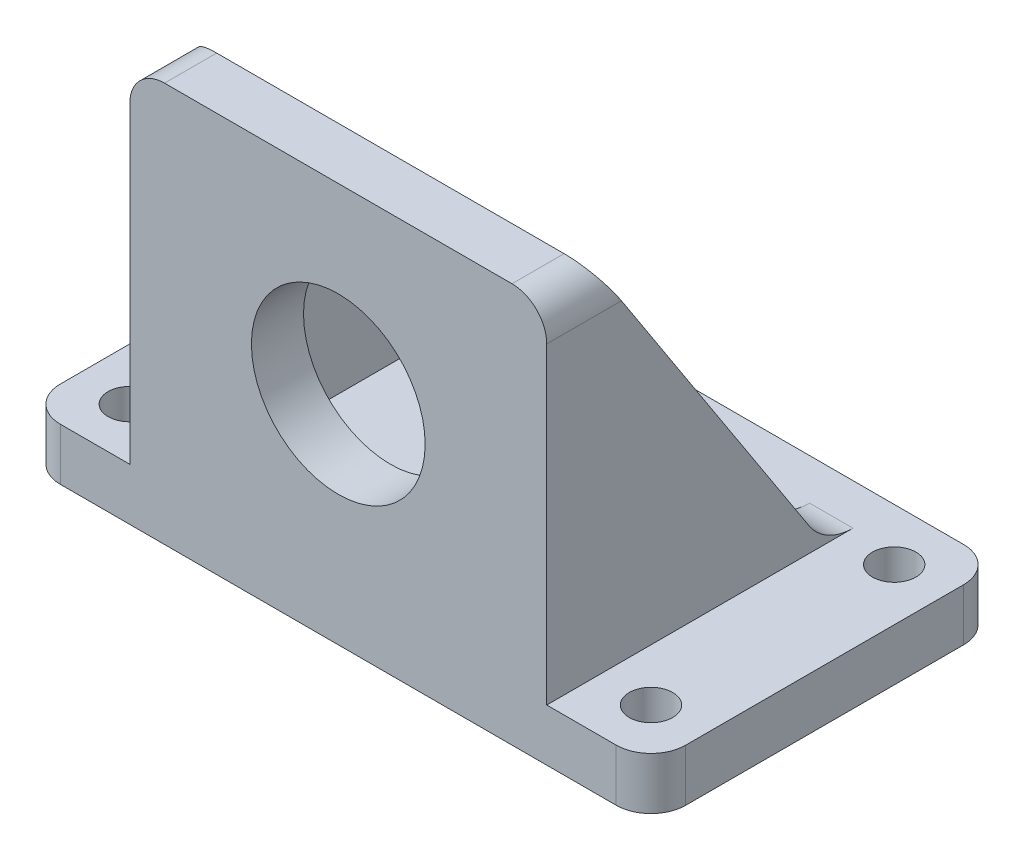
ISO-10303-21;
HEADER;
FILE_DESCRIPTION(('STEP AP214'),'2;1');
FILE_NAME('part.step','',(''),(''),'','','');
FILE_SCHEMA(('AUTOMOTIVE_DESIGN { 1 0 10303 214 1 1 1 1 }'));
ENDSEC;
DATA;
#1=APPLICATION_CONTEXT('core data for automotive mechanical design processes');
#2=APPLICATION_PROTOCOL_DEFINITION('international standard','automotive_design',2000,#1);
#3=PRODUCT_CONTEXT('',#1,'mechanical');
#4=PRODUCT('Part','Part','',(#3));
#5=PRODUCT_RELATED_PRODUCT_CATEGORY('part','',(#4));
#6=PRODUCT_DEFINITION_FORMATION('','',#4);
#7=PRODUCT_DEFINITION_CONTEXT('part definition',#1,'design');
#8=PRODUCT_DEFINITION('design','',#6,#7);
#9=PRODUCT_DEFINITION_SHAPE('','',#8);
#10=(LENGTH_UNIT() NAMED_UNIT(*) SI_UNIT(.MILLI.,.METRE.));
#11=(NAMED_UNIT(*) PLANE_ANGLE_UNIT() SI_UNIT($,.RADIAN.));
#12=(NAMED_UNIT(*) SI_UNIT($,.STERADIAN.) SOLID_ANGLE_UNIT());
#13=UNCERTAINTY_MEASURE_WITH_UNIT(LENGTH_MEASURE(1.E-05),#10,'distance_accuracy_value','');
#14=(GEOMETRIC_REPRESENTATION_CONTEXT(3) GLOBAL_UNCERTAINTY_ASSIGNED_CONTEXT((#13)) GLOBAL_UNIT_ASSIGNED_CONTEXT((#10,
#11,#12)) REPRESENTATION_CONTEXT('',''));
#15=CARTESIAN_POINT('',(0.,0.,0.));
#16=DIRECTION('',(0.,0.,1.));
#17=DIRECTION('',(1.,0.,0.));
#18=AXIS2_PLACEMENT_3D('',#15,#16,#17);
#19=CARTESIAN_POINT('',(0.,3.,0.));
#20=DIRECTION('',(0.,-1.,0.));
#21=DIRECTION('',(0.,0.,-1.));
#22=AXIS2_PLACEMENT_3D('',#19,#20,#21);
#23=PLANE('',#22);
#24=CARTESIAN_POINT('',(2.99999999999999,3.,-17.));
#25=DIRECTION('',(0.,1.,0.));
#26=DIRECTION('',(0.,0.,1.));
#27=AXIS2_PLACEMENT_3D('',#24,#25,#26);
#28=CIRCLE('',#27,1.25);
#29=CARTESIAN_POINT('',(2.99999999999999,3.,-15.75));
#30=VERTEX_POINT('',#29);
#31=EDGE_CURVE('E217',#30,#30,#28,.T.);
#32=ORIENTED_EDGE('',*,*,#31,.F.);
#33=EDGE_LOOP('',(#32));
#34=FACE_BOUND('',#33,.T.);
#35=CARTESIAN_POINT('',(33.,3.,-3.));
#36=DIRECTION('',(0.,1.,0.));
#37=DIRECTION('',(0.,0.,1.));
#38=AXIS2_PLACEMENT_3D('',#35,#36,#37);
#39=CIRCLE('',#38,1.25);
#40=CARTESIAN_POINT('',(33.,3.,-1.75));
#41=VERTEX_POINT('',#40);
#42=EDGE_CURVE('E212',#41,#41,#39,.T.);
#43=ORIENTED_EDGE('',*,*,#42,.F.);
#44=EDGE_LOOP('',(#43));
#45=FACE_BOUND('',#44,.T.);
#46=CARTESIAN_POINT('',(33.,3.,-17.));
#47=DIRECTION('',(0.,1.,0.));
#48=DIRECTION('',(0.,0.,1.));
#49=AXIS2_PLACEMENT_3D('',#46,#47,#48);
#50=CIRCLE('',#49,1.25);
#51=CARTESIAN_POINT('',(33.,3.,-15.75));
#52=VERTEX_POINT('',#51);
#53=EDGE_CURVE('E223',#52,#52,#50,.T.);
#54=ORIENTED_EDGE('',*,*,#53,.F.);
#55=EDGE_LOOP('',(#54));
#56=FACE_BOUND('',#55,.T.);
#57=DIRECTION('',(0.,0.,1.));
#58=VECTOR('',#57,1.);
#59=CARTESIAN_POINT('',(6.,3.,0.));
#60=LINE('',#59,#58);
#61=CARTESIAN_POINT('',(6.,3.,-17.628058132563));
#62=VERTEX_POINT('',#61);
#63=CARTESIAN_POINT('',(6.,3.,0.));
#64=VERTEX_POINT('',#63);
#65=EDGE_CURVE('E334',#62,#64,#60,.T.);
#66=ORIENTED_EDGE('',*,*,#65,.F.);
#67=DIRECTION('',(-1.,0.,0.));
#68=VECTOR('',#67,1.);
#69=CARTESIAN_POINT('',(8.5,3.,-17.628058132563));
#70=LINE('',#69,#68);
#71=CARTESIAN_POINT('',(8.5,3.,-17.628058132563));
#72=VERTEX_POINT('',#71);
#73=EDGE_CURVE('E301',#62,#72,#70,.F.);
#74=ORIENTED_EDGE('',*,*,#73,.T.);
#75=DIRECTION('',(0.,0.,-1.));
#76=VECTOR('',#75,1.);
#77=CARTESIAN_POINT('',(8.5,3.,-16.));
#78=LINE('',#77,#76);
#79=CARTESIAN_POINT('',(8.5,3.,-3.));
#80=VERTEX_POINT('',#79);
#81=EDGE_CURVE('E206',#80,#72,#78,.T.);
#82=ORIENTED_EDGE('',*,*,#81,.F.);
#83=DIRECTION('',(-1.,0.,0.));
#84=VECTOR('',#83,1.);
#85=CARTESIAN_POINT('',(8.5,3.,-3.));
#86=LINE('',#85,#84);
#87=CARTESIAN_POINT('',(27.5,3.,-3.));
#88=VERTEX_POINT('',#87);
#89=EDGE_CURVE('E200',#88,#80,#86,.T.);
#90=ORIENTED_EDGE('',*,*,#89,.F.);
#91=DIRECTION('',(0.,0.,1.));
#92=VECTOR('',#91,1.);
#93=CARTESIAN_POINT('',(27.5,3.,-3.));
#94=LINE('',#93,#92);
#95=CARTESIAN_POINT('',(27.5,3.,-17.628058132563));
#96=VERTEX_POINT('',#95);
#97=EDGE_CURVE('E402',#96,#88,#94,.T.);
#98=ORIENTED_EDGE('',*,*,#97,.F.);
#99=DIRECTION('',(-1.,0.,0.));
#100=VECTOR('',#99,1.);
#101=CARTESIAN_POINT('',(30.,3.,-17.628058132563));
#102=LINE('',#101,#100);
#103=CARTESIAN_POINT('',(30.,3.,-17.628058132563));
#104=VERTEX_POINT('',#103);
#105=EDGE_CURVE('E298',#96,#104,#102,.F.);
#106=ORIENTED_EDGE('',*,*,#105,.T.);
#107=DIRECTION('',(0.,0.,-1.));
#108=VECTOR('',#107,1.);
#109=CARTESIAN_POINT('',(30.,3.,0.));
#110=LINE('',#109,#108);
#111=CARTESIAN_POINT('',(30.,3.,0.));
#112=VERTEX_POINT('',#111);
#113=EDGE_CURVE('E352',#112,#104,#110,.T.);
#114=ORIENTED_EDGE('',*,*,#113,.F.);
#115=DIRECTION('',(1.,0.,0.));
#116=VECTOR('',#115,1.);
#117=CARTESIAN_POINT('',(0.,3.,0.));
#118=LINE('',#117,#116);
#119=CARTESIAN_POINT('',(34.,3.,0.));
#120=VERTEX_POINT('',#119);
#121=EDGE_CURVE('E240',#112,#120,#118,.T.);
#122=ORIENTED_EDGE('',*,*,#121,.T.);
#123=CARTESIAN_POINT('',(34.,3.,-2.));
#124=DIRECTION('',(0.,-1.,0.));
#125=DIRECTION('',(0.,0.,-1.));
#126=AXIS2_PLACEMENT_3D('',#123,#124,#125);
#127=CIRCLE('',#126,2.);
#128=CARTESIAN_POINT('',(36.,3.,-2.));
#129=VERTEX_POINT('',#128);
#130=EDGE_CURVE('E280',#120,#129,#127,.F.);
#131=ORIENTED_EDGE('',*,*,#130,.T.);
#132=DIRECTION('',(0.,0.,-1.));
#133=VECTOR('',#132,1.);
#134=CARTESIAN_POINT('',(36.,3.,0.));
#135=LINE('',#134,#133);
#136=CARTESIAN_POINT('',(36.,3.,-18.));
#137=VERTEX_POINT('',#136);
#138=EDGE_CURVE('E245',#129,#137,#135,.T.);
#139=ORIENTED_EDGE('',*,*,#138,.T.);
#140=CARTESIAN_POINT('',(34.,3.,-18.));
#141=DIRECTION('',(0.,-1.,0.));
#142=DIRECTION('',(0.,0.,-1.));
#143=AXIS2_PLACEMENT_3D('',#140,#141,#142);
#144=CIRCLE('',#143,2.);
#145=CARTESIAN_POINT('',(34.,3.,-20.));
#146=VERTEX_POINT('',#145);
#147=EDGE_CURVE('E278',#137,#146,#144,.F.);
#148=ORIENTED_EDGE('',*,*,#147,.T.);
#149=DIRECTION('',(-1.,0.,0.));
#150=VECTOR('',#149,1.);
#151=CARTESIAN_POINT('',(0.,3.,-20.));
#152=LINE('',#151,#150);
#153=CARTESIAN_POINT('',(2.,3.,-20.));
#154=VERTEX_POINT('',#153);
#155=EDGE_CURVE('E187',#146,#154,#152,.T.);
#156=ORIENTED_EDGE('',*,*,#155,.T.);
#157=CARTESIAN_POINT('',(2.,3.,-18.));
#158=DIRECTION('',(0.,-1.,0.));
#159=DIRECTION('',(0.,0.,-1.));
#160=AXIS2_PLACEMENT_3D('',#157,#158,#159);
#161=CIRCLE('',#160,2.);
#162=CARTESIAN_POINT('',(0.,3.,-18.));
#163=VERTEX_POINT('',#162);
#164=EDGE_CURVE('E284',#154,#163,#161,.F.);
#165=ORIENTED_EDGE('',*,*,#164,.T.);
#166=DIRECTION('',(0.,0.,1.));
#167=VECTOR('',#166,1.);
#168=CARTESIAN_POINT('',(0.,3.,0.));
#169=LINE('',#168,#167);
#170=CARTESIAN_POINT('',(0.,3.,-2.));
#171=VERTEX_POINT('',#170);
#172=EDGE_CURVE('E237',#163,#171,#169,.T.);
#173=ORIENTED_EDGE('',*,*,#172,.T.);
#174=CARTESIAN_POINT('',(2.,3.,-2.));
#175=DIRECTION('',(0.,-1.,0.));
#176=DIRECTION('',(0.,0.,-1.));
#177=AXIS2_PLACEMENT_3D('',#174,#175,#176);
#178=CIRCLE('',#177,2.);
#179=CARTESIAN_POINT('',(2.,3.,0.));
#180=VERTEX_POINT('',#179);
#181=EDGE_CURVE('E282',#171,#180,#178,.F.);
#182=ORIENTED_EDGE('',*,*,#181,.T.);
#183=EDGE_CURVE('E242',#180,#64,#118,.T.);
#184=ORIENTED_EDGE('',*,*,#183,.T.);
#185=EDGE_LOOP('',(#66,#74,#82,#90,#98,#106,#114,#122,#131,#139,#148,#156,#165,#173,#182,#184));
#186=FACE_BOUND('',#185,.T.);
#187=CARTESIAN_POINT('',(3.,3.,-3.));
#188=DIRECTION('',(0.,1.,0.));
#189=DIRECTION('',(0.,0.,1.));
#190=AXIS2_PLACEMENT_3D('',#187,#188,#189);
#191=CIRCLE('',#190,1.25);
#192=CARTESIAN_POINT('',(3.,3.,-1.75));
#193=VERTEX_POINT('',#192);
#194=EDGE_CURVE('E216',#193,#193,#191,.T.);
#195=ORIENTED_EDGE('',*,*,#194,.F.);
#196=EDGE_LOOP('',(#195));
#197=FACE_BOUND('',#196,.T.);
#198=ADVANCED_FACE('F34',(#34,#45,#56,#186,#197),#23,.F.);
#199=CARTESIAN_POINT('',(0.,3.,0.));
#200=DIRECTION('',(1.,0.,0.));
#201=DIRECTION('',(0.,0.,-1.));
#202=AXIS2_PLACEMENT_3D('',#199,#200,#201);
#203=PLANE('',#202);
#204=ORIENTED_EDGE('',*,*,#172,.F.);
#205=DIRECTION('',(0.,-1.,0.));
#206=VECTOR('',#205,1.);
#207=CARTESIAN_POINT('',(0.,3.,-18.));
#208=LINE('',#207,#206);
#209=CARTESIAN_POINT('',(0.,0.,-18.));
#210=VERTEX_POINT('',#209);
#211=EDGE_CURVE('E262',#163,#210,#208,.T.);
#212=ORIENTED_EDGE('',*,*,#211,.T.);
#213=DIRECTION('',(0.,0.,1.));
#214=VECTOR('',#213,1.);
#215=CARTESIAN_POINT('',(0.,0.,0.));
#216=LINE('',#215,#214);
#217=CARTESIAN_POINT('',(0.,0.,-2.));
#218=VERTEX_POINT('',#217);
#219=EDGE_CURVE('E234',#210,#218,#216,.T.);
#220=ORIENTED_EDGE('',*,*,#219,.T.);
#221=DIRECTION('',(0.,-1.,0.));
#222=VECTOR('',#221,1.);
#223=CARTESIAN_POINT('',(0.,3.,-2.));
#224=LINE('',#223,#222);
#225=EDGE_CURVE('E260',#218,#171,#224,.F.);
#226=ORIENTED_EDGE('',*,*,#225,.T.);
#227=EDGE_LOOP('',(#204,#212,#220,#226));
#228=FACE_BOUND('',#227,.T.);
#229=ADVANCED_FACE('F379',(#228),#203,.F.);
#230=CARTESIAN_POINT('',(0.,3.,0.));
#231=DIRECTION('',(0.,0.,-1.));
#232=DIRECTION('',(-1.,0.,0.));
#233=AXIS2_PLACEMENT_3D('',#230,#231,#232);
#234=PLANE('',#233);
#235=CARTESIAN_POINT('',(18.,12.5,0.));
#236=DIRECTION('',(0.,0.,1.));
#237=DIRECTION('',(1.,0.,0.));
#238=AXIS2_PLACEMENT_3D('',#235,#236,#237);
#239=CIRCLE('',#238,5.);
#240=CARTESIAN_POINT('',(23.,12.5,0.));
#241=VERTEX_POINT('',#240);
#242=EDGE_CURVE('E392',#241,#241,#239,.T.);
#243=ORIENTED_EDGE('',*,*,#242,.F.);
#244=EDGE_LOOP('',(#243));
#245=FACE_BOUND('',#244,.T.);
#246=DIRECTION('',(1.,0.,0.));
#247=VECTOR('',#246,1.);
#248=CARTESIAN_POINT('',(6.,23.,0.));
#249=LINE('',#248,#247);
#250=CARTESIAN_POINT('',(8.,23.,0.));
#251=VERTEX_POINT('',#250);
#252=CARTESIAN_POINT('',(28.,23.,0.));
#253=VERTEX_POINT('',#252);
#254=EDGE_CURVE('E196',#251,#253,#249,.T.);
#255=ORIENTED_EDGE('',*,*,#254,.F.);
#256=CARTESIAN_POINT('',(8.,21.,0.));
#257=DIRECTION('',(0.,0.,-1.));
#258=DIRECTION('',(-1.,0.,0.));
#259=AXIS2_PLACEMENT_3D('',#256,#257,#258);
#260=CIRCLE('',#259,2.);
#261=CARTESIAN_POINT('',(6.,21.,0.));
#262=VERTEX_POINT('',#261);
#263=EDGE_CURVE('E323',#251,#262,#260,.F.);
#264=ORIENTED_EDGE('',*,*,#263,.T.);
#265=DIRECTION('',(0.,-1.,0.));
#266=VECTOR('',#265,1.);
#267=CARTESIAN_POINT('',(6.,23.,0.));
#268=LINE('',#267,#266);
#269=EDGE_CURVE('E210',#262,#64,#268,.T.);
#270=ORIENTED_EDGE('',*,*,#269,.T.);
#271=ORIENTED_EDGE('',*,*,#183,.F.);
#272=DIRECTION('',(0.,-1.,0.));
#273=VECTOR('',#272,1.);
#274=CARTESIAN_POINT('',(2.,3.,0.));
#275=LINE('',#274,#273);
#276=CARTESIAN_POINT('',(2.,0.,0.));
#277=VERTEX_POINT('',#276);
#278=EDGE_CURVE('E288',#180,#277,#275,.T.);
#279=ORIENTED_EDGE('',*,*,#278,.T.);
#280=DIRECTION('',(1.,0.,0.));
#281=VECTOR('',#280,1.);
#282=CARTESIAN_POINT('',(0.,0.,0.));
#283=LINE('',#282,#281);
#284=CARTESIAN_POINT('',(34.,0.,0.));
#285=VERTEX_POINT('',#284);
#286=EDGE_CURVE('E252',#277,#285,#283,.T.);
#287=ORIENTED_EDGE('',*,*,#286,.T.);
#288=DIRECTION('',(0.,-1.,0.));
#289=VECTOR('',#288,1.);
#290=CARTESIAN_POINT('',(34.,3.,0.));
#291=LINE('',#290,#289);
#292=EDGE_CURVE('E286',#285,#120,#291,.F.);
#293=ORIENTED_EDGE('',*,*,#292,.T.);
#294=ORIENTED_EDGE('',*,*,#121,.F.);
#295=DIRECTION('',(0.,-1.,0.));
#296=VECTOR('',#295,1.);
#297=CARTESIAN_POINT('',(30.,23.,0.));
#298=LINE('',#297,#296);
#299=CARTESIAN_POINT('',(30.,21.,0.));
#300=VERTEX_POINT('',#299);
#301=EDGE_CURVE('E203',#300,#112,#298,.T.);
#302=ORIENTED_EDGE('',*,*,#301,.F.);
#303=CARTESIAN_POINT('',(28.,21.,0.));
#304=DIRECTION('',(0.,0.,-1.));
#305=DIRECTION('',(-1.,0.,0.));
#306=AXIS2_PLACEMENT_3D('',#303,#304,#305);
#307=CIRCLE('',#306,2.);
#308=EDGE_CURVE('E321',#300,#253,#307,.F.);
#309=ORIENTED_EDGE('',*,*,#308,.T.);
#310=EDGE_LOOP('',(#255,#264,#270,#271,#279,#287,#293,#294,#302,#309));
#311=FACE_BOUND('',#310,.T.);
#312=ADVANCED_FACE('F328',(#245,#311),#234,.F.);
#313=CARTESIAN_POINT('',(36.,3.,0.));
#314=DIRECTION('',(-1.,0.,0.));
#315=DIRECTION('',(0.,0.,1.));
#316=AXIS2_PLACEMENT_3D('',#313,#314,#315);
#317=PLANE('',#316);
#318=ORIENTED_EDGE('',*,*,#138,.F.);
#319=DIRECTION('',(0.,-1.,0.));
#320=VECTOR('',#319,1.);
#321=CARTESIAN_POINT('',(36.,3.,-2.));
#322=LINE('',#321,#320);
#323=CARTESIAN_POINT('',(36.,0.,-2.));
#324=VERTEX_POINT('',#323);
#325=EDGE_CURVE('E293',#129,#324,#322,.T.);
#326=ORIENTED_EDGE('',*,*,#325,.T.);
#327=DIRECTION('',(0.,0.,-1.));
#328=VECTOR('',#327,1.);
#329=CARTESIAN_POINT('',(36.,0.,0.));
#330=LINE('',#329,#328);
#331=CARTESIAN_POINT('',(36.,0.,-18.));
#332=VERTEX_POINT('',#331);
#333=EDGE_CURVE('E255',#324,#332,#330,.T.);
#334=ORIENTED_EDGE('',*,*,#333,.T.);
#335=DIRECTION('',(0.,-1.,0.));
#336=VECTOR('',#335,1.);
#337=CARTESIAN_POINT('',(36.,3.,-18.));
#338=LINE('',#337,#336);
#339=EDGE_CURVE('E291',#332,#137,#338,.F.);
#340=ORIENTED_EDGE('',*,*,#339,.T.);
#341=EDGE_LOOP('',(#318,#326,#334,#340));
#342=FACE_BOUND('',#341,.T.);
#343=ADVANCED_FACE('F358',(#342),#317,.F.);
#344=CARTESIAN_POINT('',(0.,3.,-20.));
#345=DIRECTION('',(0.,0.,1.));
#346=DIRECTION('',(1.,0.,0.));
#347=AXIS2_PLACEMENT_3D('',#344,#345,#346);
#348=PLANE('',#347);
#349=DIRECTION('',(-1.,0.,0.));
#350=VECTOR('',#349,1.);
#351=CARTESIAN_POINT('',(0.,0.,-20.));
#352=LINE('',#351,#350);
#353=CARTESIAN_POINT('',(34.,0.,-20.));
#354=VERTEX_POINT('',#353);
#355=CARTESIAN_POINT('',(2.,0.,-20.));
#356=VERTEX_POINT('',#355);
#357=EDGE_CURVE('E241',#354,#356,#352,.T.);
#358=ORIENTED_EDGE('',*,*,#357,.T.);
#359=DIRECTION('',(0.,-1.,0.));
#360=VECTOR('',#359,1.);
#361=CARTESIAN_POINT('',(2.,3.,-20.));
#362=LINE('',#361,#360);
#363=EDGE_CURVE('E276',#356,#154,#362,.F.);
#364=ORIENTED_EDGE('',*,*,#363,.T.);
#365=ORIENTED_EDGE('',*,*,#155,.F.);
#366=DIRECTION('',(0.,-1.,0.));
#367=VECTOR('',#366,1.);
#368=CARTESIAN_POINT('',(34.,3.,-20.));
#369=LINE('',#368,#367);
#370=EDGE_CURVE('E273',#146,#354,#369,.T.);
#371=ORIENTED_EDGE('',*,*,#370,.T.);
#372=EDGE_LOOP('',(#358,#364,#365,#371));
#373=FACE_BOUND('',#372,.T.);
#374=ADVANCED_FACE('F371',(#373),#348,.F.);
#375=CARTESIAN_POINT('',(0.,0.,0.));
#376=DIRECTION('',(0.,-1.,0.));
#377=DIRECTION('',(0.,0.,-1.));
#378=AXIS2_PLACEMENT_3D('',#375,#376,#377);
#379=PLANE('',#378);
#380=CARTESIAN_POINT('',(2.99999999999999,0.,-17.));
#381=DIRECTION('',(0.,1.,0.));
#382=DIRECTION('',(0.,0.,1.));
#383=AXIS2_PLACEMENT_3D('',#380,#381,#382);
#384=CIRCLE('',#383,1.25);
#385=CARTESIAN_POINT('',(2.99999999999999,0.,-15.75));
#386=VERTEX_POINT('',#385);
#387=EDGE_CURVE('E213',#386,#386,#384,.T.);
#388=ORIENTED_EDGE('',*,*,#387,.T.);
#389=EDGE_LOOP('',(#388));
#390=FACE_BOUND('',#389,.T.);
#391=CARTESIAN_POINT('',(33.,0.,-17.));
#392=DIRECTION('',(0.,1.,0.));
#393=DIRECTION('',(0.,0.,1.));
#394=AXIS2_PLACEMENT_3D('',#391,#392,#393);
#395=CIRCLE('',#394,1.25);
#396=CARTESIAN_POINT('',(33.,0.,-15.75));
#397=VERTEX_POINT('',#396);
#398=EDGE_CURVE('E220',#397,#397,#395,.T.);
#399=ORIENTED_EDGE('',*,*,#398,.T.);
#400=EDGE_LOOP('',(#399));
#401=FACE_BOUND('',#400,.T.);
#402=CARTESIAN_POINT('',(33.,0.,-3.));
#403=DIRECTION('',(0.,1.,0.));
#404=DIRECTION('',(0.,0.,1.));
#405=AXIS2_PLACEMENT_3D('',#402,#403,#404);
#406=CIRCLE('',#405,1.25);
#407=CARTESIAN_POINT('',(33.,0.,-1.75));
#408=VERTEX_POINT('',#407);
#409=EDGE_CURVE('E226',#408,#408,#406,.T.);
#410=ORIENTED_EDGE('',*,*,#409,.T.);
#411=EDGE_LOOP('',(#410));
#412=FACE_BOUND('',#411,.T.);
#413=CARTESIAN_POINT('',(3.,0.,-3.));
#414=DIRECTION('',(0.,1.,0.));
#415=DIRECTION('',(0.,0.,1.));
#416=AXIS2_PLACEMENT_3D('',#413,#414,#415);
#417=CIRCLE('',#416,1.25);
#418=CARTESIAN_POINT('',(3.,0.,-1.75));
#419=VERTEX_POINT('',#418);
#420=EDGE_CURVE('E231',#419,#419,#417,.T.);
#421=ORIENTED_EDGE('',*,*,#420,.T.);
#422=EDGE_LOOP('',(#421));
#423=FACE_BOUND('',#422,.T.);
#424=ORIENTED_EDGE('',*,*,#219,.F.);
#425=CARTESIAN_POINT('',(2.,0.,-18.));
#426=DIRECTION('',(0.,-1.,0.));
#427=DIRECTION('',(0.,0.,-1.));
#428=AXIS2_PLACEMENT_3D('',#425,#426,#427);
#429=CIRCLE('',#428,2.);
#430=EDGE_CURVE('E271',#210,#356,#429,.T.);
#431=ORIENTED_EDGE('',*,*,#430,.T.);
#432=ORIENTED_EDGE('',*,*,#357,.F.);
#433=CARTESIAN_POINT('',(34.,0.,-18.));
#434=DIRECTION('',(0.,-1.,0.));
#435=DIRECTION('',(0.,0.,-1.));
#436=AXIS2_PLACEMENT_3D('',#433,#434,#435);
#437=CIRCLE('',#436,2.);
#438=EDGE_CURVE('E265',#354,#332,#437,.T.);
#439=ORIENTED_EDGE('',*,*,#438,.T.);
#440=ORIENTED_EDGE('',*,*,#333,.F.);
#441=CARTESIAN_POINT('',(34.,0.,-2.));
#442=DIRECTION('',(0.,-1.,0.));
#443=DIRECTION('',(0.,0.,-1.));
#444=AXIS2_PLACEMENT_3D('',#441,#442,#443);
#445=CIRCLE('',#444,2.);
#446=EDGE_CURVE('E267',#324,#285,#445,.T.);
#447=ORIENTED_EDGE('',*,*,#446,.T.);
#448=ORIENTED_EDGE('',*,*,#286,.F.);
#449=CARTESIAN_POINT('',(2.,0.,-2.));
#450=DIRECTION('',(0.,-1.,0.));
#451=DIRECTION('',(0.,0.,-1.));
#452=AXIS2_PLACEMENT_3D('',#449,#450,#451);
#453=CIRCLE('',#452,2.);
#454=EDGE_CURVE('E269',#277,#218,#453,.T.);
#455=ORIENTED_EDGE('',*,*,#454,.T.);
#456=EDGE_LOOP('',(#424,#431,#432,#439,#440,#447,#448,#455));
#457=FACE_BOUND('',#456,.T.);
#458=ADVANCED_FACE('F362',(#390,#401,#412,#423,#457),#379,.T.);
#459=CARTESIAN_POINT('',(3.,0.,-3.));
#460=DIRECTION('',(0.,1.,0.));
#461=DIRECTION('',(0.,0.,1.));
#462=AXIS2_PLACEMENT_3D('',#459,#460,#461);
#463=CYLINDRICAL_SURFACE('',#462,1.25);
#464=ORIENTED_EDGE('',*,*,#420,.F.);
#465=EDGE_LOOP('',(#464));
#466=FACE_BOUND('',#465,.T.);
#467=ORIENTED_EDGE('',*,*,#194,.T.);
#468=EDGE_LOOP('',(#467));
#469=FACE_BOUND('',#468,.T.);
#470=ADVANCED_FACE('F434',(#466,#469),#463,.F.);
#471=CARTESIAN_POINT('',(33.,0.,-3.));
#472=DIRECTION('',(0.,1.,0.));
#473=DIRECTION('',(0.,0.,1.));
#474=AXIS2_PLACEMENT_3D('',#471,#472,#473);
#475=CYLINDRICAL_SURFACE('',#474,1.25);
#476=ORIENTED_EDGE('',*,*,#409,.F.);
#477=EDGE_LOOP('',(#476));
#478=FACE_BOUND('',#477,.T.);
#479=ORIENTED_EDGE('',*,*,#42,.T.);
#480=EDGE_LOOP('',(#479));
#481=FACE_BOUND('',#480,.T.);
#482=ADVANCED_FACE('F625',(#478,#481),#475,.F.);
#483=CARTESIAN_POINT('',(33.,0.,-17.));
#484=DIRECTION('',(0.,1.,0.));
#485=DIRECTION('',(0.,0.,1.));
#486=AXIS2_PLACEMENT_3D('',#483,#484,#485);
#487=CYLINDRICAL_SURFACE('',#486,1.25);
#488=ORIENTED_EDGE('',*,*,#398,.F.);
#489=EDGE_LOOP('',(#488));
#490=FACE_BOUND('',#489,.T.);
#491=ORIENTED_EDGE('',*,*,#53,.T.);
#492=EDGE_LOOP('',(#491));
#493=FACE_BOUND('',#492,.T.);
#494=ADVANCED_FACE('F609',(#490,#493),#487,.F.);
#495=CARTESIAN_POINT('',(2.99999999999999,0.,-17.));
#496=DIRECTION('',(0.,1.,0.));
#497=DIRECTION('',(0.,0.,1.));
#498=AXIS2_PLACEMENT_3D('',#495,#496,#497);
#499=CYLINDRICAL_SURFACE('',#498,1.25);
#500=ORIENTED_EDGE('',*,*,#387,.F.);
#501=EDGE_LOOP('',(#500));
#502=FACE_BOUND('',#501,.T.);
#503=ORIENTED_EDGE('',*,*,#31,.T.);
#504=EDGE_LOOP('',(#503));
#505=FACE_BOUND('',#504,.T.);
#506=ADVANCED_FACE('F508',(#502,#505),#499,.F.);
#507=CARTESIAN_POINT('',(6.,23.,0.));
#508=DIRECTION('',(1.,0.,0.));
#509=DIRECTION('',(0.,0.,-1.));
#510=AXIS2_PLACEMENT_3D('',#507,#508,#509);
#511=PLANE('',#510);
#512=ORIENTED_EDGE('',*,*,#269,.F.);
#513=DIRECTION('',(0.,0.,1.));
#514=VECTOR('',#513,1.);
#515=CARTESIAN_POINT('',(6.,21.,0.));
#516=LINE('',#515,#514);
#517=CARTESIAN_POINT('',(6.,21.,-4.3));
#518=VERTEX_POINT('',#517);
#519=EDGE_CURVE('E56',#262,#518,#516,.F.);
#520=ORIENTED_EDGE('',*,*,#519,.T.);
#521=DIRECTION('',(0.,-0.838443616300637,-0.544988350595414));
#522=VECTOR('',#521,1.);
#523=CARTESIAN_POINT('',(6.,24.3708260105448,-2.10896309314587));
#524=LINE('',#523,#522);
#525=CARTESIAN_POINT('',(6.,4.36503494821375,-15.1127272836611));
#526=VERTEX_POINT('',#525);
#527=EDGE_CURVE('E389',#518,#526,#524,.T.);
#528=ORIENTED_EDGE('',*,*,#527,.T.);
#529=CARTESIAN_POINT('',(6.,6.,-17.628058132563));
#530=DIRECTION('',(1.,0.,0.));
#531=DIRECTION('',(0.,0.,-1.));
#532=AXIS2_PLACEMENT_3D('',#529,#530,#531);
#533=CIRCLE('',#532,3.);
#534=EDGE_CURVE('E307',#526,#62,#533,.T.);
#535=ORIENTED_EDGE('',*,*,#534,.T.);
#536=ORIENTED_EDGE('',*,*,#65,.T.);
#537=EDGE_LOOP('',(#512,#520,#528,#535,#536));
#538=FACE_BOUND('',#537,.T.);
#539=ADVANCED_FACE('F333',(#538),#511,.F.);
#540=CARTESIAN_POINT('',(30.,23.,0.));
#541=DIRECTION('',(-1.,0.,0.));
#542=DIRECTION('',(0.,0.,1.));
#543=AXIS2_PLACEMENT_3D('',#540,#541,#542);
#544=PLANE('',#543);
#545=DIRECTION('',(0.,-0.838443616300637,-0.544988350595414));
#546=VECTOR('',#545,1.);
#547=CARTESIAN_POINT('',(30.,3.,-16.));
#548=LINE('',#547,#546);
#549=CARTESIAN_POINT('',(30.,21.,-4.30000000000001));
#550=VERTEX_POINT('',#549);
#551=CARTESIAN_POINT('',(30.,4.36503494821376,-15.1127272836611));
#552=VERTEX_POINT('',#551);
#553=EDGE_CURVE('E175',#550,#552,#548,.T.);
#554=ORIENTED_EDGE('',*,*,#553,.F.);
#555=DIRECTION('',(0.,0.,-1.));
#556=VECTOR('',#555,1.);
#557=CARTESIAN_POINT('',(30.,21.,0.));
#558=LINE('',#557,#556);
#559=EDGE_CURVE('E11',#550,#300,#558,.F.);
#560=ORIENTED_EDGE('',*,*,#559,.T.);
#561=ORIENTED_EDGE('',*,*,#301,.T.);
#562=ORIENTED_EDGE('',*,*,#113,.T.);
#563=CARTESIAN_POINT('',(30.,6.,-17.628058132563));
#564=DIRECTION('',(-1.,0.,0.));
#565=DIRECTION('',(0.,0.,1.));
#566=AXIS2_PLACEMENT_3D('',#563,#564,#565);
#567=CIRCLE('',#566,3.);
#568=EDGE_CURVE('E314',#104,#552,#567,.T.);
#569=ORIENTED_EDGE('',*,*,#568,.T.);
#570=EDGE_LOOP('',(#554,#560,#561,#562,#569));
#571=FACE_BOUND('',#570,.T.);
#572=ADVANCED_FACE('F343',(#571),#544,.F.);
#573=CARTESIAN_POINT('',(27.5,23.,-3.));
#574=DIRECTION('',(1.,0.,0.));
#575=DIRECTION('',(0.,0.,-1.));
#576=AXIS2_PLACEMENT_3D('',#573,#574,#575);
#577=PLANE('',#576);
#578=DIRECTION('',(0.,-1.,0.));
#579=VECTOR('',#578,1.);
#580=CARTESIAN_POINT('',(27.5,23.,-3.));
#581=LINE('',#580,#579);
#582=CARTESIAN_POINT('',(27.5,23.,-3.));
#583=VERTEX_POINT('',#582);
#584=EDGE_CURVE('E201',#583,#88,#581,.T.);
#585=ORIENTED_EDGE('',*,*,#584,.F.);
#586=DIRECTION('',(0.,-0.838443616300637,-0.544988350595414));
#587=VECTOR('',#586,1.);
#588=CARTESIAN_POINT('',(27.5,23.,-3.));
#589=LINE('',#588,#587);
#590=CARTESIAN_POINT('',(27.5,4.36503494821375,-15.1127272836611));
#591=VERTEX_POINT('',#590);
#592=EDGE_CURVE('E174',#583,#591,#589,.T.);
#593=ORIENTED_EDGE('',*,*,#592,.T.);
#594=CARTESIAN_POINT('',(27.5,6.,-17.628058132563));
#595=DIRECTION('',(1.,0.,0.));
#596=DIRECTION('',(0.,0.,-1.));
#597=AXIS2_PLACEMENT_3D('',#594,#595,#596);
#598=CIRCLE('',#597,3.);
#599=EDGE_CURVE('E311',#591,#96,#598,.T.);
#600=ORIENTED_EDGE('',*,*,#599,.T.);
#601=ORIENTED_EDGE('',*,*,#97,.T.);
#602=EDGE_LOOP('',(#585,#593,#600,#601));
#603=FACE_BOUND('',#602,.T.);
#604=ADVANCED_FACE('F406',(#603),#577,.F.);
#605=CARTESIAN_POINT('',(8.5,23.,-3.));
#606=DIRECTION('',(0.,0.,1.));
#607=DIRECTION('',(1.,0.,0.));
#608=AXIS2_PLACEMENT_3D('',#605,#606,#607);
#609=PLANE('',#608);
#610=CARTESIAN_POINT('',(18.,12.5,-3.));
#611=DIRECTION('',(0.,0.,1.));
#612=DIRECTION('',(1.,0.,0.));
#613=AXIS2_PLACEMENT_3D('',#610,#611,#612);
#614=CIRCLE('',#613,5.);
#615=CARTESIAN_POINT('',(23.,12.5,-3.));
#616=VERTEX_POINT('',#615);
#617=EDGE_CURVE('E386',#616,#616,#614,.F.);
#618=ORIENTED_EDGE('',*,*,#617,.F.);
#619=EDGE_LOOP('',(#618));
#620=FACE_BOUND('',#619,.T.);
#621=ORIENTED_EDGE('',*,*,#89,.T.);
#622=DIRECTION('',(0.,-1.,0.));
#623=VECTOR('',#622,1.);
#624=CARTESIAN_POINT('',(8.5,23.,-3.));
#625=LINE('',#624,#623);
#626=CARTESIAN_POINT('',(8.5,23.,-3.));
#627=VERTEX_POINT('',#626);
#628=EDGE_CURVE('E168',#627,#80,#625,.T.);
#629=ORIENTED_EDGE('',*,*,#628,.F.);
#630=DIRECTION('',(-1.,0.,0.));
#631=VECTOR('',#630,1.);
#632=CARTESIAN_POINT('',(8.5,23.,-3.));
#633=LINE('',#632,#631);
#634=EDGE_CURVE('E190',#583,#627,#633,.T.);
#635=ORIENTED_EDGE('',*,*,#634,.F.);
#636=ORIENTED_EDGE('',*,*,#584,.T.);
#637=EDGE_LOOP('',(#621,#629,#635,#636));
#638=FACE_BOUND('',#637,.T.);
#639=ADVANCED_FACE('F199',(#620,#638),#609,.F.);
#640=CARTESIAN_POINT('',(8.5,23.,-16.));
#641=DIRECTION('',(-1.,0.,0.));
#642=DIRECTION('',(0.,0.,1.));
#643=AXIS2_PLACEMENT_3D('',#640,#641,#642);
#644=PLANE('',#643);
#645=ORIENTED_EDGE('',*,*,#81,.T.);
#646=CARTESIAN_POINT('',(8.5,6.,-17.628058132563));
#647=DIRECTION('',(-1.,0.,0.));
#648=DIRECTION('',(0.,0.,1.));
#649=AXIS2_PLACEMENT_3D('',#646,#647,#648);
#650=CIRCLE('',#649,3.);
#651=CARTESIAN_POINT('',(8.5,4.36503494821375,-15.1127272836611));
#652=VERTEX_POINT('',#651);
#653=EDGE_CURVE('E170',#72,#652,#650,.T.);
#654=ORIENTED_EDGE('',*,*,#653,.T.);
#655=DIRECTION('',(0.,0.838443616300637,0.544988350595414));
#656=VECTOR('',#655,1.);
#657=CARTESIAN_POINT('',(8.5,17.0597539543058,-6.86115992970123));
#658=LINE('',#657,#656);
#659=EDGE_CURVE('E164',#652,#627,#658,.T.);
#660=ORIENTED_EDGE('',*,*,#659,.T.);
#661=ORIENTED_EDGE('',*,*,#628,.T.);
#662=EDGE_LOOP('',(#645,#654,#660,#661));
#663=FACE_BOUND('',#662,.T.);
#664=ADVANCED_FACE('F166',(#663),#644,.F.);
#665=CARTESIAN_POINT('',(0.,23.,0.));
#666=DIRECTION('',(0.,-1.,0.));
#667=DIRECTION('',(0.,0.,-1.));
#668=AXIS2_PLACEMENT_3D('',#665,#666,#667);
#669=PLANE('',#668);
#670=DIRECTION('',(-1.,0.,0.));
#671=VECTOR('',#670,1.);
#672=CARTESIAN_POINT('',(0.,23.,-3.));
#673=LINE('',#672,#671);
#674=CARTESIAN_POINT('',(8.,23.,-3.));
#675=VERTEX_POINT('',#674);
#676=EDGE_CURVE('E178',#627,#675,#673,.T.);
#677=ORIENTED_EDGE('',*,*,#676,.T.);
#678=DIRECTION('',(0.,0.,1.));
#679=VECTOR('',#678,1.);
#680=CARTESIAN_POINT('',(8.,23.,0.));
#681=LINE('',#680,#679);
#682=EDGE_CURVE('E319',#675,#251,#681,.T.);
#683=ORIENTED_EDGE('',*,*,#682,.T.);
#684=ORIENTED_EDGE('',*,*,#254,.T.);
#685=DIRECTION('',(0.,0.,-1.));
#686=VECTOR('',#685,1.);
#687=CARTESIAN_POINT('',(28.,23.,0.));
#688=LINE('',#687,#686);
#689=CARTESIAN_POINT('',(28.,23.,-3.));
#690=VERTEX_POINT('',#689);
#691=EDGE_CURVE('E317',#253,#690,#688,.T.);
#692=ORIENTED_EDGE('',*,*,#691,.T.);
#693=EDGE_CURVE('E186',#690,#583,#673,.T.);
#694=ORIENTED_EDGE('',*,*,#693,.T.);
#695=ORIENTED_EDGE('',*,*,#634,.T.);
#696=EDGE_LOOP('',(#677,#683,#684,#692,#694,#695));
#697=FACE_BOUND('',#696,.T.);
#698=ADVANCED_FACE('F191',(#697),#669,.F.);
#699=CARTESIAN_POINT('',(18.,12.5,-20.001));
#700=DIRECTION('',(0.,0.,1.));
#701=DIRECTION('',(1.,0.,0.));
#702=AXIS2_PLACEMENT_3D('',#699,#700,#701);
#703=CYLINDRICAL_SURFACE('',#702,5.);
#704=ORIENTED_EDGE('',*,*,#242,.T.);
#705=EDGE_LOOP('',(#704));
#706=FACE_BOUND('',#705,.T.);
#707=ORIENTED_EDGE('',*,*,#617,.T.);
#708=EDGE_LOOP('',(#707));
#709=FACE_BOUND('',#708,.T.);
#710=ADVANCED_FACE('F421',(#706,#709),#703,.F.);
#711=CARTESIAN_POINT('',(0.,3.,-16.));
#712=DIRECTION('',(0.,-0.544988350595414,0.838443616300637));
#713=DIRECTION('',(0.,-0.838443616300637,-0.544988350595414));
#714=AXIS2_PLACEMENT_3D('',#711,#712,#713);
#715=PLANE('',#714);
#716=ORIENTED_EDGE('',*,*,#527,.F.);
#717=CARTESIAN_POINT('',(8.,21.,-4.3));
#718=DIRECTION('',(0.,-0.544988350595414,0.838443616300637));
#719=DIRECTION('',(0.,0.838443616300637,0.544988350595414));
#720=AXIS2_PLACEMENT_3D('',#717,#718,#719);
#721=ELLIPSE('',#720,2.38537208837531,2.);
#722=EDGE_CURVE('E182',#518,#675,#721,.F.);
#723=ORIENTED_EDGE('',*,*,#722,.T.);
#724=ORIENTED_EDGE('',*,*,#676,.F.);
#725=ORIENTED_EDGE('',*,*,#659,.F.);
#726=DIRECTION('',(-1.,0.,0.));
#727=VECTOR('',#726,1.);
#728=CARTESIAN_POINT('',(6.,4.36503494821376,-15.1127272836611));
#729=LINE('',#728,#727);
#730=EDGE_CURVE('E296',#652,#526,#729,.T.);
#731=ORIENTED_EDGE('',*,*,#730,.T.);
#732=EDGE_LOOP('',(#716,#723,#724,#725,#731));
#733=FACE_BOUND('',#732,.T.);
#734=ADVANCED_FACE('F180',(#733),#715,.F.);
#735=ORIENTED_EDGE('',*,*,#693,.F.);
#736=CARTESIAN_POINT('',(28.,21.,-4.3));
#737=DIRECTION('',(0.,-0.544988350595414,0.838443616300637));
#738=DIRECTION('',(0.,-0.838443616300637,-0.544988350595414));
#739=AXIS2_PLACEMENT_3D('',#736,#737,#738);
#740=ELLIPSE('',#739,2.38537208837531,2.);
#741=EDGE_CURVE('E42',#690,#550,#740,.F.);
#742=ORIENTED_EDGE('',*,*,#741,.T.);
#743=ORIENTED_EDGE('',*,*,#553,.T.);
#744=DIRECTION('',(-1.,0.,0.));
#745=VECTOR('',#744,1.);
#746=CARTESIAN_POINT('',(27.5,4.36503494821376,-15.1127272836611));
#747=LINE('',#746,#745);
#748=EDGE_CURVE('E304',#552,#591,#747,.T.);
#749=ORIENTED_EDGE('',*,*,#748,.T.);
#750=ORIENTED_EDGE('',*,*,#592,.F.);
#751=EDGE_LOOP('',(#735,#742,#743,#749,#750));
#752=FACE_BOUND('',#751,.T.);
#753=ADVANCED_FACE('F412',(#752),#715,.F.);
#754=CARTESIAN_POINT('',(2.,3.,-18.));
#755=DIRECTION('',(0.,-1.,0.));
#756=DIRECTION('',(0.,0.,-1.));
#757=AXIS2_PLACEMENT_3D('',#754,#755,#756);
#758=CYLINDRICAL_SURFACE('',#757,2.);
#759=ORIENTED_EDGE('',*,*,#164,.F.);
#760=ORIENTED_EDGE('',*,*,#363,.F.);
#761=ORIENTED_EDGE('',*,*,#430,.F.);
#762=ORIENTED_EDGE('',*,*,#211,.F.);
#763=EDGE_LOOP('',(#759,#760,#761,#762));
#764=FACE_BOUND('',#763,.T.);
#765=ADVANCED_FACE('F377',(#764),#758,.T.);
#766=CARTESIAN_POINT('',(2.,3.,-2.));
#767=DIRECTION('',(0.,-1.,0.));
#768=DIRECTION('',(0.,0.,-1.));
#769=AXIS2_PLACEMENT_3D('',#766,#767,#768);
#770=CYLINDRICAL_SURFACE('',#769,2.);
#771=ORIENTED_EDGE('',*,*,#181,.F.);
#772=ORIENTED_EDGE('',*,*,#225,.F.);
#773=ORIENTED_EDGE('',*,*,#454,.F.);
#774=ORIENTED_EDGE('',*,*,#278,.F.);
#775=EDGE_LOOP('',(#771,#772,#773,#774));
#776=FACE_BOUND('',#775,.T.);
#777=ADVANCED_FACE('F384',(#776),#770,.T.);
#778=CARTESIAN_POINT('',(34.,3.,-2.));
#779=DIRECTION('',(0.,-1.,0.));
#780=DIRECTION('',(0.,0.,-1.));
#781=AXIS2_PLACEMENT_3D('',#778,#779,#780);
#782=CYLINDRICAL_SURFACE('',#781,2.);
#783=ORIENTED_EDGE('',*,*,#130,.F.);
#784=ORIENTED_EDGE('',*,*,#292,.F.);
#785=ORIENTED_EDGE('',*,*,#446,.F.);
#786=ORIENTED_EDGE('',*,*,#325,.F.);
#787=EDGE_LOOP('',(#783,#784,#785,#786));
#788=FACE_BOUND('',#787,.T.);
#789=ADVANCED_FACE('F355',(#788),#782,.T.);
#790=CARTESIAN_POINT('',(34.,3.,-18.));
#791=DIRECTION('',(0.,-1.,0.));
#792=DIRECTION('',(0.,0.,-1.));
#793=AXIS2_PLACEMENT_3D('',#790,#791,#792);
#794=CYLINDRICAL_SURFACE('',#793,2.);
#795=ORIENTED_EDGE('',*,*,#147,.F.);
#796=ORIENTED_EDGE('',*,*,#339,.F.);
#797=ORIENTED_EDGE('',*,*,#438,.F.);
#798=ORIENTED_EDGE('',*,*,#370,.F.);
#799=EDGE_LOOP('',(#795,#796,#797,#798));
#800=FACE_BOUND('',#799,.T.);
#801=ADVANCED_FACE('F368',(#800),#794,.T.);
#802=CARTESIAN_POINT('',(0.,6.,-17.628058132563));
#803=DIRECTION('',(1.,0.,0.));
#804=DIRECTION('',(0.,0.,-1.));
#805=AXIS2_PLACEMENT_3D('',#802,#803,#804);
#806=CYLINDRICAL_SURFACE('',#805,3.);
#807=ORIENTED_EDGE('',*,*,#653,.F.);
#808=ORIENTED_EDGE('',*,*,#73,.F.);
#809=ORIENTED_EDGE('',*,*,#534,.F.);
#810=ORIENTED_EDGE('',*,*,#730,.F.);
#811=EDGE_LOOP('',(#807,#808,#809,#810));
#812=FACE_BOUND('',#811,.T.);
#813=ADVANCED_FACE('F391',(#812),#806,.F.);
#814=CARTESIAN_POINT('',(0.,6.,-17.628058132563));
#815=DIRECTION('',(1.,0.,0.));
#816=DIRECTION('',(0.,0.,-1.));
#817=AXIS2_PLACEMENT_3D('',#814,#815,#816);
#818=CYLINDRICAL_SURFACE('',#817,3.);
#819=ORIENTED_EDGE('',*,*,#568,.F.);
#820=ORIENTED_EDGE('',*,*,#105,.F.);
#821=ORIENTED_EDGE('',*,*,#599,.F.);
#822=ORIENTED_EDGE('',*,*,#748,.F.);
#823=EDGE_LOOP('',(#819,#820,#821,#822));
#824=FACE_BOUND('',#823,.T.);
#825=ADVANCED_FACE('F411',(#824),#818,.F.);
#826=CARTESIAN_POINT('',(8.,21.,0.));
#827=DIRECTION('',(0.,0.,1.));
#828=DIRECTION('',(1.,0.,0.));
#829=AXIS2_PLACEMENT_3D('',#826,#827,#828);
#830=CYLINDRICAL_SURFACE('',#829,2.);
#831=ORIENTED_EDGE('',*,*,#722,.F.);
#832=ORIENTED_EDGE('',*,*,#519,.F.);
#833=ORIENTED_EDGE('',*,*,#263,.F.);
#834=ORIENTED_EDGE('',*,*,#682,.F.);
#835=EDGE_LOOP('',(#831,#832,#833,#834));
#836=FACE_BOUND('',#835,.T.);
#837=ADVANCED_FACE('F335',(#836),#830,.T.);
#838=CARTESIAN_POINT('',(28.,21.,0.));
#839=DIRECTION('',(0.,0.,-1.));
#840=DIRECTION('',(-1.,0.,0.));
#841=AXIS2_PLACEMENT_3D('',#838,#839,#840);
#842=CYLINDRICAL_SURFACE('',#841,2.);
#843=ORIENTED_EDGE('',*,*,#308,.F.);
#844=ORIENTED_EDGE('',*,*,#559,.F.);
#845=ORIENTED_EDGE('',*,*,#741,.F.);
#846=ORIENTED_EDGE('',*,*,#691,.F.);
#847=EDGE_LOOP('',(#843,#844,#845,#846));
#848=FACE_BOUND('',#847,.T.);
#849=ADVANCED_FACE('F36',(#848),#842,.T.);
#850=CLOSED_SHELL('',(#198,#229,#312,#343,#374,#458,#470,#482,#494,#506,#539,#572,#604,#639,
#664,#698,#710,#734,#753,#765,#777,#789,#801,#813,#825,#837,#849));
#851=MANIFOLD_SOLID_BREP('B2',#850);
#852=ADVANCED_BREP_SHAPE_REPRESENTATION('',(#18,#851),#14);
#853=SHAPE_DEFINITION_REPRESENTATION(#9,#852);
ENDSEC;
END-ISO-10303-21;
